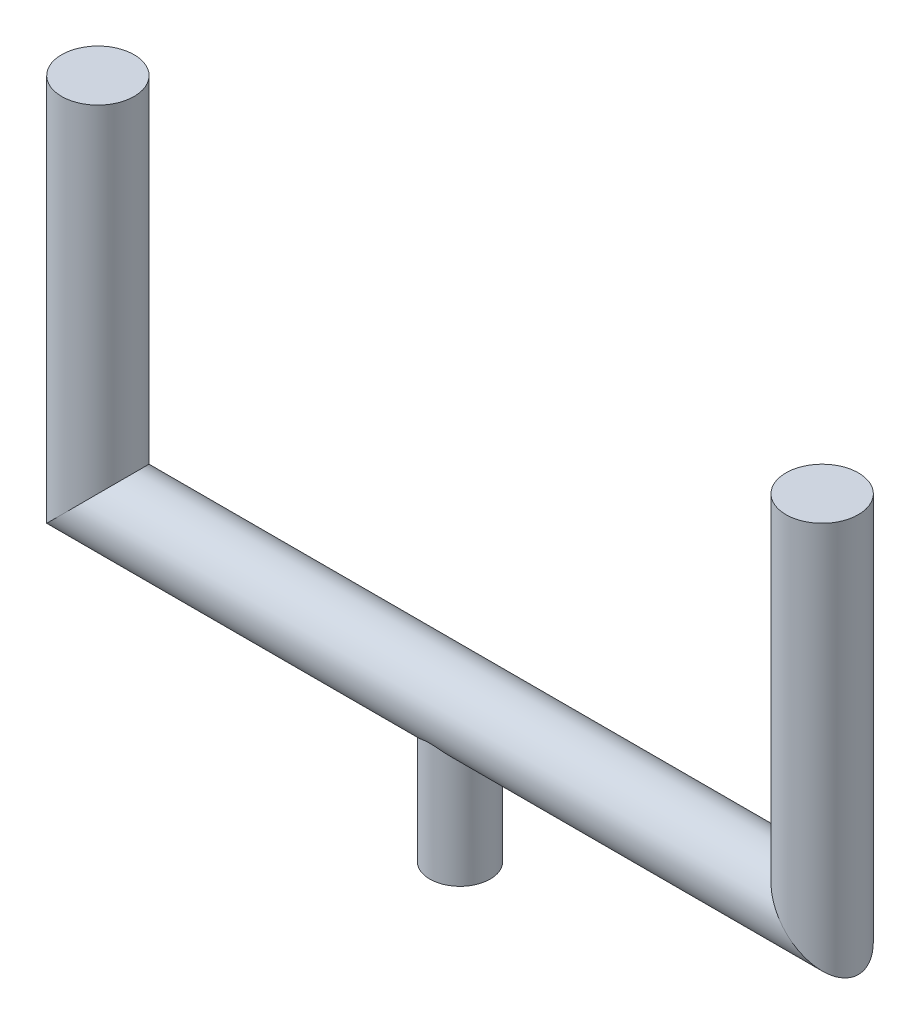
ISO-10303-21;
HEADER;
FILE_DESCRIPTION(('STEP AP214'),'2;1');
FILE_NAME('part.step','',(''),(''),'','','');
FILE_SCHEMA(('AUTOMOTIVE_DESIGN { 1 0 10303 214 1 1 1 1 }'));
ENDSEC;
DATA;
#1=APPLICATION_CONTEXT('core data for automotive mechanical design processes');
#2=APPLICATION_PROTOCOL_DEFINITION('international standard','automotive_design',2000,#1);
#3=PRODUCT_CONTEXT('',#1,'mechanical');
#4=PRODUCT('Part','Part','',(#3));
#5=PRODUCT_RELATED_PRODUCT_CATEGORY('part','',(#4));
#6=PRODUCT_DEFINITION_FORMATION('','',#4);
#7=PRODUCT_DEFINITION_CONTEXT('part definition',#1,'design');
#8=PRODUCT_DEFINITION('design','',#6,#7);
#9=PRODUCT_DEFINITION_SHAPE('','',#8);
#10=(LENGTH_UNIT() NAMED_UNIT(*) SI_UNIT(.MILLI.,.METRE.));
#11=(NAMED_UNIT(*) PLANE_ANGLE_UNIT() SI_UNIT($,.RADIAN.));
#12=(NAMED_UNIT(*) SI_UNIT($,.STERADIAN.) SOLID_ANGLE_UNIT());
#13=UNCERTAINTY_MEASURE_WITH_UNIT(LENGTH_MEASURE(1.E-05),#10,'distance_accuracy_value','');
#14=(GEOMETRIC_REPRESENTATION_CONTEXT(3) GLOBAL_UNCERTAINTY_ASSIGNED_CONTEXT((#13)) GLOBAL_UNIT_ASSIGNED_CONTEXT((#10,
#11,#12)) REPRESENTATION_CONTEXT('',''));
#15=CARTESIAN_POINT('',(0.,0.,0.));
#16=DIRECTION('',(0.,0.,1.));
#17=DIRECTION('',(1.,0.,0.));
#18=AXIS2_PLACEMENT_3D('',#15,#16,#17);
#19=CARTESIAN_POINT('',(0.,0.,0.));
#20=DIRECTION('',(0.,1.,0.));
#21=DIRECTION('',(0.,0.,1.));
#22=AXIS2_PLACEMENT_3D('',#19,#20,#21);
#23=PLANE('',#22);
#24=CARTESIAN_POINT('',(0.,0.,0.));
#25=DIRECTION('',(0.,1.,0.));
#26=DIRECTION('',(0.,0.,1.));
#27=AXIS2_PLACEMENT_3D('',#24,#25,#26);
#28=CIRCLE('',#27,3.);
#29=CARTESIAN_POINT('',(0.,0.,3.));
#30=VERTEX_POINT('',#29);
#31=EDGE_CURVE('E58',#30,#30,#28,.T.);
#32=ORIENTED_EDGE('',*,*,#31,.T.);
#33=EDGE_LOOP('',(#32));
#34=FACE_BOUND('',#33,.T.);
#35=ADVANCED_FACE('F33',(#34),#23,.T.);
#36=CARTESIAN_POINT('',(60.,0.,0.));
#37=DIRECTION('',(0.,-1.,0.));
#38=DIRECTION('',(0.,0.,1.));
#39=AXIS2_PLACEMENT_3D('',#36,#37,#38);
#40=PLANE('',#39);
#41=CARTESIAN_POINT('',(60.,0.,0.));
#42=DIRECTION('',(0.,-1.,0.));
#43=DIRECTION('',(0.,0.,1.));
#44=AXIS2_PLACEMENT_3D('',#41,#42,#43);
#45=CIRCLE('',#44,3.);
#46=CARTESIAN_POINT('',(60.,0.,3.));
#47=VERTEX_POINT('',#46);
#48=EDGE_CURVE('E48',#47,#47,#45,.T.);
#49=ORIENTED_EDGE('',*,*,#48,.F.);
#50=EDGE_LOOP('',(#49));
#51=FACE_BOUND('',#50,.T.);
#52=ADVANCED_FACE('F88',(#51),#40,.F.);
#53=CARTESIAN_POINT('',(0.,-36.7,0.));
#54=DIRECTION('',(0.,1.,0.));
#55=DIRECTION('',(0.,0.,1.));
#56=AXIS2_PLACEMENT_3D('',#53,#54,#55);
#57=CYLINDRICAL_SURFACE('',#56,3.);
#58=CARTESIAN_POINT('',(0.,-30.,0.));
#59=DIRECTION('',(-0.707106781186548,0.707106781186548,0.));
#60=DIRECTION('',(-0.707106781186548,-0.707106781186548,0.));
#61=AXIS2_PLACEMENT_3D('',#58,#59,#60);
#62=ELLIPSE('',#61,4.24264068711928,3.);
#63=CARTESIAN_POINT('',(-3.,-33.,0.));
#64=VERTEX_POINT('',#63);
#65=EDGE_CURVE('E53',#64,#64,#62,.F.);
#66=ORIENTED_EDGE('',*,*,#65,.F.);
#67=EDGE_LOOP('',(#66));
#68=FACE_BOUND('',#67,.T.);
#69=ORIENTED_EDGE('',*,*,#31,.F.);
#70=EDGE_LOOP('',(#69));
#71=FACE_BOUND('',#70,.T.);
#72=ADVANCED_FACE('F82',(#68,#71),#57,.T.);
#73=CARTESIAN_POINT('',(66.7,-30.,0.));
#74=DIRECTION('',(-1.,0.,0.));
#75=DIRECTION('',(0.,0.,1.));
#76=AXIS2_PLACEMENT_3D('',#73,#74,#75);
#77=CYLINDRICAL_SURFACE('',#76,3.);
#78=CARTESIAN_POINT('',(30.,-31.6582846838223,2.50001838141251));
#79=CARTESIAN_POINT('',(29.9116967193956,-31.6583007740211,2.50001219927517));
#80=CARTESIAN_POINT('',(29.8232424741468,-31.6654933477109,2.49528116176394));
#81=CARTESIAN_POINT('',(29.6492266185365,-31.6927685051553,2.47684887983311));
#82=CARTESIAN_POINT('',(29.5636760145364,-31.7128953783081,2.4631168110025));
#83=CARTESIAN_POINT('',(29.3649023619255,-31.7723033639611,2.42088890376703));
#84=CARTESIAN_POINT('',(29.2538169824894,-31.8159859251794,2.38873248667223));
#85=CARTESIAN_POINT('',(29.0408326546212,-31.9133402716309,2.31149369539278));
#86=CARTESIAN_POINT('',(28.9389648565933,-31.9670441791014,2.26636949601936));
#87=CARTESIAN_POINT('',(28.7709660522612,-32.0632864449317,2.1784993270213));
#88=CARTESIAN_POINT('',(28.7027496361292,-32.1047992882512,2.13855415339399));
#89=CARTESIAN_POINT('',(28.5707232725171,-32.1886424341152,2.05266979545852));
#90=CARTESIAN_POINT('',(28.5069152364836,-32.2309730812008,2.00672803570339));
#91=CARTESIAN_POINT('',(28.3222519506549,-32.3572531874962,1.86008805557145));
#92=CARTESIAN_POINT('',(28.2078712713873,-32.440665350414,1.75042473918081));
#93=CARTESIAN_POINT('',(28.0214124233085,-32.5810678090811,1.53333906752397));
#94=CARTESIAN_POINT('',(27.9455075501151,-32.6399096509948,1.43037534679362));
#95=CARTESIAN_POINT('',(27.8086674110621,-32.7477462538285,1.21029958254026));
#96=CARTESIAN_POINT('',(27.7477078987852,-32.7967569403902,1.09321092120809));
#97=CARTESIAN_POINT('',(27.6528899729874,-32.8737213751747,0.867956639596691));
#98=CARTESIAN_POINT('',(27.6161684875983,-32.9038504771542,0.761746639115));
#99=CARTESIAN_POINT('',(27.5570212655027,-32.9525990652199,0.542860119010318));
#100=CARTESIAN_POINT('',(27.5345872899718,-32.9712251842584,0.430187367040222));
#101=CARTESIAN_POINT('',(27.5053990510111,-32.9954899161492,0.200931534526568));
#102=CARTESIAN_POINT('',(27.4987103740692,-33.001074202949,0.0843341423850495));
#103=CARTESIAN_POINT('',(27.5017018818818,-32.9985826480637,-0.148503218297136));
#104=CARTESIAN_POINT('',(27.5113817035849,-32.9905071093518,-0.264743194707956));
#105=CARTESIAN_POINT('',(27.5452133272512,-32.9624171333291,-0.485423009521763));
#106=CARTESIAN_POINT('',(27.5683500288931,-32.9432405253627,-0.590131169156231));
#107=CARTESIAN_POINT('',(27.6269464815505,-32.8950192636468,-0.793603863058815));
#108=CARTESIAN_POINT('',(27.6624080002826,-32.8659731943595,-0.892367542340347));
#109=CARTESIAN_POINT('',(27.7475894732043,-32.7969115807894,-1.09051174553846));
#110=CARTESIAN_POINT('',(27.798269876518,-32.7561700515807,-1.18922185908054));
#111=CARTESIAN_POINT('',(27.9103944442452,-32.667458862741,-1.37675738126831));
#112=CARTESIAN_POINT('',(27.9718482829232,-32.6194827120687,-1.46557378738951));
#113=CARTESIAN_POINT('',(28.1354562045372,-32.4945025274592,-1.67278189784233));
#114=CARTESIAN_POINT('',(28.2430675057078,-32.4145441084837,-1.78515209080151));
#115=CARTESIAN_POINT('',(28.4172356614373,-32.2920581831899,-1.93667969180631));
#116=CARTESIAN_POINT('',(28.477509214993,-32.2507458698151,-1.98440515274904));
#117=CARTESIAN_POINT('',(28.6022661906879,-32.1683049437453,-2.07416478207105));
#118=CARTESIAN_POINT('',(28.6667480867923,-32.1271762701754,-2.11620099668223));
#119=CARTESIAN_POINT('',(28.8311132083394,-32.027383261096,-2.21280716133712));
#120=CARTESIAN_POINT('',(28.9334591727547,-31.9695052761356,-2.26405531410887));
#121=CARTESIAN_POINT('',(29.1478588080174,-31.8621627770848,-2.35312132137366));
#122=CARTESIAN_POINT('',(29.2598837851183,-31.8126746012197,-2.39097728544665));
#123=CARTESIAN_POINT('',(29.4558214053035,-31.7437914599745,-2.44139276540113));
#124=CARTESIAN_POINT('',(29.5370008555167,-31.7198451396842,-2.45817563576834));
#125=CARTESIAN_POINT('',(29.7029655331672,-31.6828029840282,-2.4836849138238));
#126=CARTESIAN_POINT('',(29.7877417864219,-31.6696816414831,-2.49243026610903));
#127=CARTESIAN_POINT('',(29.95943536527,-31.6566206083695,-2.50113695297561));
#128=CARTESIAN_POINT('',(30.046363683194,-31.6567760917388,-2.50103486526459));
#129=CARTESIAN_POINT('',(30.2187162855511,-31.6704801937842,-2.49189669544372));
#130=CARTESIAN_POINT('',(30.3041383206563,-31.6840473577664,-2.48284824254103));
#131=CARTESIAN_POINT('',(30.4921985936832,-31.7268289078478,-2.45333932289263));
#132=CARTESIAN_POINT('',(30.5937407496825,-31.7591282022426,-2.43057501449661));
#133=CARTESIAN_POINT('',(30.7896513281275,-31.8344948176685,-2.37420109722465));
#134=CARTESIAN_POINT('',(30.8839947519003,-31.8775976167556,-2.34055564752243));
#135=CARTESIAN_POINT('',(31.0460163722555,-31.9597169304043,-2.27194632688823));
#136=CARTESIAN_POINT('',(31.1150672373888,-31.9976202651145,-2.2388204170933));
#137=CARTESIAN_POINT('',(31.2490497958335,-32.0753851714067,-2.16692886361114));
#138=CARTESIAN_POINT('',(31.3139793373086,-32.1152477469913,-2.1281603079956));
#139=CARTESIAN_POINT('',(31.439854837632,-32.1956581335864,-2.04509866907883));
#140=CARTESIAN_POINT('',(31.5007974810582,-32.2362064804783,-2.00080107475586));
#141=CARTESIAN_POINT('',(31.6186053610059,-32.3169200724969,-1.90676064710784));
#142=CARTESIAN_POINT('',(31.6754684572095,-32.357085107078,-1.85701498955916));
#143=CARTESIAN_POINT('',(31.8424737924204,-32.4776379410672,-1.69687576867191));
#144=CARTESIAN_POINT('',(31.9459554048005,-32.5560362933334,-1.57758831489154));
#145=CARTESIAN_POINT('',(32.0847365820788,-32.6637119657815,-1.38209590755368));
#146=CARTESIAN_POINT('',(32.1282257928732,-32.6979245292944,-1.31423835608952));
#147=CARTESIAN_POINT('',(32.2091305320617,-32.7621892778867,-1.17316133510891));
#148=CARTESIAN_POINT('',(32.2465496556502,-32.7922439240556,-1.09994507701931));
#149=CARTESIAN_POINT('',(32.3259281871975,-32.8564424240259,-0.92318562680505));
#150=CARTESIAN_POINT('',(32.3652262962338,-32.8885966193121,-0.817684064944659));
#151=CARTESIAN_POINT('',(32.4296429774202,-32.9415728097642,-0.599751808824727));
#152=CARTESIAN_POINT('',(32.4547725870422,-32.962403625556,-0.487326584149968));
#153=CARTESIAN_POINT('',(32.4893798330965,-32.9911413629286,-0.257859447998162));
#154=CARTESIAN_POINT('',(32.4987821100333,-32.9989860580314,-0.140798044428104));
#155=CARTESIAN_POINT('',(32.5009947021713,-33.0008282427709,0.0935925712245029));
#156=CARTESIAN_POINT('',(32.4938062280756,-32.994826742828,0.210921763141109));
#157=CARTESIAN_POINT('',(32.4645012187047,-32.9704699416761,0.433518552363038));
#158=CARTESIAN_POINT('',(32.4435093826804,-32.9530456705724,0.539042458523934));
#159=CARTESIAN_POINT('',(32.3889500360398,-32.9080608515206,0.744480170915108));
#160=CARTESIAN_POINT('',(32.3553805587963,-32.880498718439,0.844393097007505));
#161=CARTESIAN_POINT('',(32.2743745073582,-32.8146298880932,1.04387713642916));
#162=CARTESIAN_POINT('',(32.2261089552952,-32.7756890362209,1.1428981973559));
#163=CARTESIAN_POINT('',(32.118783970411,-32.6903801757196,1.33138703679193));
#164=CARTESIAN_POINT('',(32.0597162148686,-32.6440064437432,1.42084736430018));
#165=CARTESIAN_POINT('',(31.9019417534952,-32.5226257035106,1.63006097386779));
#166=CARTESIAN_POINT('',(31.7977574705509,-32.4445031862293,1.74394025869017));
#167=CARTESIAN_POINT('',(31.6288275322838,-32.3241051724718,1.89811179051301));
#168=CARTESIAN_POINT('',(31.5703090983558,-32.283371827443,1.94678956126979));
#169=CARTESIAN_POINT('',(31.4491371662697,-32.201799598221,2.03858837417752));
#170=CARTESIAN_POINT('',(31.3864849498069,-32.1609607504777,2.08171112655436));
#171=CARTESIAN_POINT('',(31.2204869082636,-32.0574652076444,2.18512606171076));
#172=CARTESIAN_POINT('',(31.1141382896233,-31.9955092709992,2.24136470839961));
#173=CARTESIAN_POINT('',(30.8907294581664,-31.8799465518003,2.33912024096606));
#174=CARTESIAN_POINT('',(30.7736995339302,-31.8263172581659,2.38067722138247));
#175=CARTESIAN_POINT('',(30.5701172099303,-31.7519427858156,2.43558528766675));
#176=CARTESIAN_POINT('',(30.4867189008939,-31.7262156659931,2.45372240132259));
#177=CARTESIAN_POINT('',(30.3159673722773,-31.6861063788219,2.481463319098));
#178=CARTESIAN_POINT('',(30.2286307452291,-31.6716805998174,2.49109994476649));
#179=CARTESIAN_POINT('',(30.117206883521,-31.6622558427748,2.4973800704787));
#180=CARTESIAN_POINT('',(30.0938057411944,-31.6607711405152,2.49836769829556));
#181=CARTESIAN_POINT('',(30.0469399631033,-31.6587833306583,2.49968773666314));
#182=CARTESIAN_POINT('',(30.0234753163067,-31.6582804062631,2.50002002492596));
#183=CARTESIAN_POINT('',(30.,-31.6582846838223,2.50001838141251));
#184=B_SPLINE_CURVE_WITH_KNOTS('',3,(#78,#79,#80,#81,#82,#83,#84,#85,#86,#87,#88,#89,#90,#91,
#92,#93,#94,#95,#96,#97,#98,#99,#100,#101,#102,#103,#104,#105,#106,#107,#108,#109,#110,#111,
#112,#113,#114,#115,#116,#117,#118,#119,#120,#121,#122,#123,#124,#125,#126,#127,#128,#129,#130,
#131,#132,#133,#134,#135,#136,#137,#138,#139,#140,#141,#142,#143,#144,#145,#146,#147,#148,#149,
#150,#151,#152,#153,#154,#155,#156,#157,#158,#159,#160,#161,#162,#163,#164,#165,#166,#167,#168,
#169,#170,#171,#172,#173,#174,#175,#176,#177,#178,#179,#180,#181,#182,#183),.UNSPECIFIED.,.T.,
.F.,(4,2,2,2,2,2,2,2,2,2,2,2,2,2,2,2,2,2,2,2,2,2,2,2,2,2,2,2,2,2,2,2,2,2,2,2,2,2,2,2,2,2,2,2,2,
2,2,2,2,2,2,2,4),(0.,0.264804099148503,0.530519802417221,0.899301945134538,1.26928713877451,
1.53683173589339,1.80449161998025,2.33872165529689,2.75963446052399,3.17985981612087,
3.52745327876342,3.87484612137174,4.22368347563436,4.57251309282618,4.89792633560231,
5.22338627082993,5.57669629030713,5.93032521344738,6.45212500791347,6.71375016647347,
6.97528097571026,7.35901920297121,7.74165648858888,7.99962007489594,8.2569740645542,
8.51617303091216,8.77573091258913,9.10079695349461,9.42694480793148,9.68298658437196,
9.93916096462876,10.1955457351739,10.4520640479129,10.9775854966051,11.2398862652327,
11.5020311064804,11.8517762182518,12.2012484955878,12.5523905663475,12.9035070134723,
13.2290657299993,13.5546753718154,13.9038939886418,14.2533828085498,14.7693802938834,
15.0281742678072,15.2868883753247,15.6916808421172,16.095359146558,16.3618872680455,
16.6273817256282,16.6977664302835,16.7681642676489),.UNSPECIFIED.);
#185=CARTESIAN_POINT('',(30.,-31.6582846838223,2.50001838141251));
#186=VERTEX_POINT('',#185);
#187=EDGE_CURVE('E10',#186,#186,#184,.T.);
#188=ORIENTED_EDGE('',*,*,#187,.F.);
#189=EDGE_LOOP('',(#188));
#190=FACE_BOUND('',#189,.T.);
#191=CARTESIAN_POINT('',(60.,-30.,0.));
#192=DIRECTION('',(-0.707106781186548,-0.707106781186548,0.));
#193=DIRECTION('',(0.707106781186548,-0.707106781186548,0.));
#194=AXIS2_PLACEMENT_3D('',#191,#192,#193);
#195=ELLIPSE('',#194,4.24264068711928,3.);
#196=CARTESIAN_POINT('',(63.,-33.,0.));
#197=VERTEX_POINT('',#196);
#198=EDGE_CURVE('E44',#197,#197,#195,.F.);
#199=ORIENTED_EDGE('',*,*,#198,.F.);
#200=EDGE_LOOP('',(#199));
#201=FACE_BOUND('',#200,.T.);
#202=ORIENTED_EDGE('',*,*,#65,.T.);
#203=EDGE_LOOP('',(#202));
#204=FACE_BOUND('',#203,.T.);
#205=ADVANCED_FACE('F76',(#190,#201,#204),#77,.T.);
#206=CARTESIAN_POINT('',(60.,0.,0.));
#207=DIRECTION('',(0.,-1.,0.));
#208=DIRECTION('',(0.,0.,-1.));
#209=AXIS2_PLACEMENT_3D('',#206,#207,#208);
#210=CYLINDRICAL_SURFACE('',#209,3.);
#211=ORIENTED_EDGE('',*,*,#48,.T.);
#212=EDGE_LOOP('',(#211));
#213=FACE_BOUND('',#212,.T.);
#214=ORIENTED_EDGE('',*,*,#198,.T.);
#215=EDGE_LOOP('',(#214));
#216=FACE_BOUND('',#215,.T.);
#217=ADVANCED_FACE('F74',(#213,#216),#210,.T.);
#218=CARTESIAN_POINT('',(30.,-41.4002060285972,1.8381412506603E-05));
#219=DIRECTION('',(0.,1.,0.));
#220=DIRECTION('',(0.,0.,1.));
#221=AXIS2_PLACEMENT_3D('',#218,#219,#220);
#222=CYLINDRICAL_SURFACE('',#221,2.5);
#223=ORIENTED_EDGE('',*,*,#187,.T.);
#224=EDGE_LOOP('',(#223));
#225=FACE_BOUND('',#224,.T.);
#226=CARTESIAN_POINT('',(30.,-41.4002060285972,1.8381412506603E-05));
#227=DIRECTION('',(0.,1.,0.));
#228=DIRECTION('',(0.,0.,1.));
#229=AXIS2_PLACEMENT_3D('',#226,#227,#228);
#230=CIRCLE('',#229,2.5);
#231=CARTESIAN_POINT('',(30.,-41.4002060285972,2.50001838141251));
#232=VERTEX_POINT('',#231);
#233=EDGE_CURVE('E60',#232,#232,#230,.T.);
#234=ORIENTED_EDGE('',*,*,#233,.T.);
#235=EDGE_LOOP('',(#234));
#236=FACE_BOUND('',#235,.T.);
#237=ADVANCED_FACE('F66',(#225,#236),#222,.T.);
#238=CARTESIAN_POINT('',(30.,-41.4002060285972,1.8381412506603E-05));
#239=DIRECTION('',(0.,1.,0.));
#240=DIRECTION('',(0.,0.,1.));
#241=AXIS2_PLACEMENT_3D('',#238,#239,#240);
#242=PLANE('',#241);
#243=ORIENTED_EDGE('',*,*,#233,.F.);
#244=EDGE_LOOP('',(#243));
#245=FACE_BOUND('',#244,.T.);
#246=ADVANCED_FACE('F68',(#245),#242,.F.);
#247=CLOSED_SHELL('',(#35,#52,#72,#205,#217,#237,#246));
#248=MANIFOLD_SOLID_BREP('B2',#247);
#249=ADVANCED_BREP_SHAPE_REPRESENTATION('',(#18,#248),#14);
#250=SHAPE_DEFINITION_REPRESENTATION(#9,#249);
ENDSEC;
END-ISO-10303-21;
